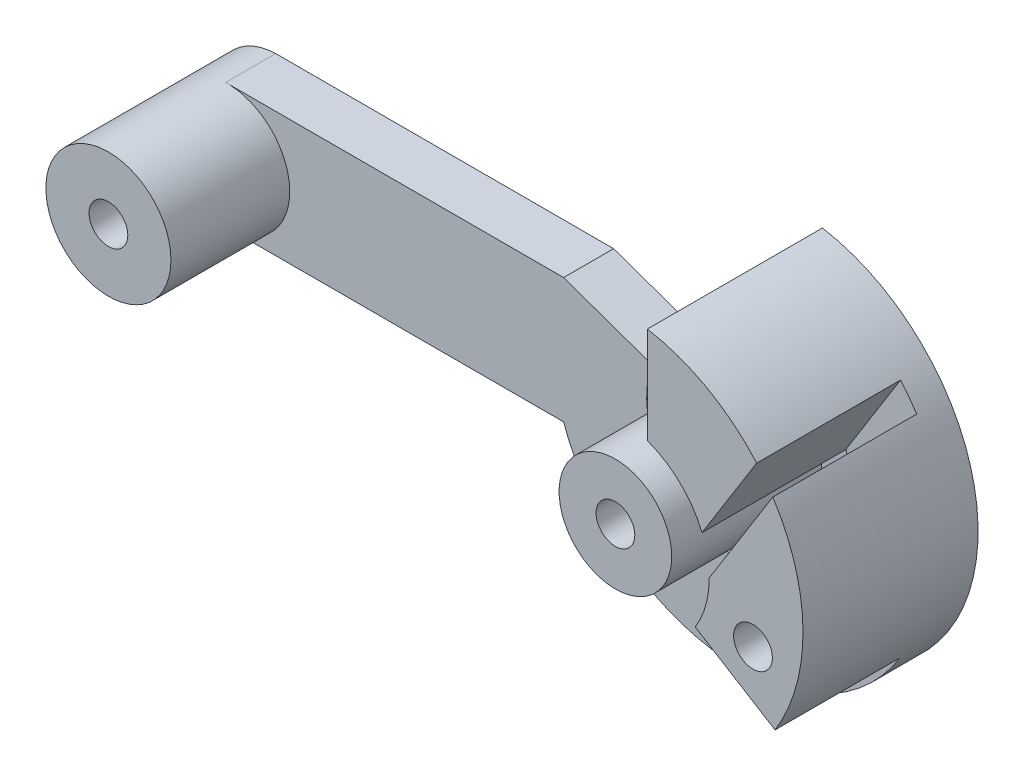
ISO-10303-21;
HEADER;
FILE_DESCRIPTION(('STEP AP214'),'2;1');
FILE_NAME('part.step','',(''),(''),'','','');
FILE_SCHEMA(('AUTOMOTIVE_DESIGN { 1 0 10303 214 1 1 1 1 }'));
ENDSEC;
DATA;
#1=APPLICATION_CONTEXT('core data for automotive mechanical design processes');
#2=APPLICATION_PROTOCOL_DEFINITION('international standard','automotive_design',2000,#1);
#3=PRODUCT_CONTEXT('',#1,'mechanical');
#4=PRODUCT('Part','Part','',(#3));
#5=PRODUCT_RELATED_PRODUCT_CATEGORY('part','',(#4));
#6=PRODUCT_DEFINITION_FORMATION('','',#4);
#7=PRODUCT_DEFINITION_CONTEXT('part definition',#1,'design');
#8=PRODUCT_DEFINITION('design','',#6,#7);
#9=PRODUCT_DEFINITION_SHAPE('','',#8);
#10=(LENGTH_UNIT() NAMED_UNIT(*) SI_UNIT(.MILLI.,.METRE.));
#11=(NAMED_UNIT(*) PLANE_ANGLE_UNIT() SI_UNIT($,.RADIAN.));
#12=(NAMED_UNIT(*) SI_UNIT($,.STERADIAN.) SOLID_ANGLE_UNIT());
#13=UNCERTAINTY_MEASURE_WITH_UNIT(LENGTH_MEASURE(1.E-05),#10,'distance_accuracy_value','');
#14=(GEOMETRIC_REPRESENTATION_CONTEXT(3) GLOBAL_UNCERTAINTY_ASSIGNED_CONTEXT((#13)) GLOBAL_UNIT_ASSIGNED_CONTEXT((#10,
#11,#12)) REPRESENTATION_CONTEXT('',''));
#15=CARTESIAN_POINT('',(0.,0.,0.));
#16=DIRECTION('',(0.,0.,1.));
#17=DIRECTION('',(1.,0.,0.));
#18=AXIS2_PLACEMENT_3D('',#15,#16,#17);
#19=CARTESIAN_POINT('',(41.0404683805728,4.39752401160121E-13,-3.));
#20=DIRECTION('',(0.,0.,1.));
#21=DIRECTION('',(1.,0.,0.));
#22=AXIS2_PLACEMENT_3D('',#19,#20,#21);
#23=PLANE('',#22);
#24=DIRECTION('',(-1.,0.,0.));
#25=VECTOR('',#24,1.);
#26=CARTESIAN_POINT('',(26.8978124930757,4.99852822817315,-3.));
#27=LINE('',#26,#25);
#28=CARTESIAN_POINT('',(26.8978124930757,4.99852822817315,-3.));
#29=VERTEX_POINT('',#28);
#30=CARTESIAN_POINT('',(0.121307675586321,4.99852822817315,-3.));
#31=VERTEX_POINT('',#30);
#32=EDGE_CURVE('E157',#29,#31,#27,.T.);
#33=ORIENTED_EDGE('',*,*,#32,.T.);
#34=CARTESIAN_POINT('',(0.,0.,-3.));
#35=DIRECTION('',(0.,0.,1.));
#36=DIRECTION('',(1.,0.,0.));
#37=AXIS2_PLACEMENT_3D('',#34,#35,#36);
#38=CIRCLE('',#37,5.);
#39=CARTESIAN_POINT('',(0.121307675586322,-4.99852822817315,-3.));
#40=VERTEX_POINT('',#39);
#41=EDGE_CURVE('E11',#31,#40,#38,.F.);
#42=ORIENTED_EDGE('',*,*,#41,.T.);
#43=DIRECTION('',(1.,0.,0.));
#44=VECTOR('',#43,1.);
#45=CARTESIAN_POINT('',(-0.121307675586332,-4.99852822817315,-3.));
#46=LINE('',#45,#44);
#47=CARTESIAN_POINT('',(26.8978124930757,-4.99852822817315,-3.));
#48=VERTEX_POINT('',#47);
#49=EDGE_CURVE('E163',#40,#48,#46,.T.);
#50=ORIENTED_EDGE('',*,*,#49,.T.);
#51=CARTESIAN_POINT('',(41.0404683805728,4.39752401160121E-13,-3.));
#52=DIRECTION('',(0.,0.,1.));
#53=DIRECTION('',(1.,0.,0.));
#54=AXIS2_PLACEMENT_3D('',#51,#52,#53);
#55=CIRCLE('',#54,15.0000000000002);
#56=CARTESIAN_POINT('',(53.8056160022448,-7.87724610488477,-3.));
#57=VERTEX_POINT('',#56);
#58=EDGE_CURVE('E299',#48,#57,#55,.T.);
#59=ORIENTED_EDGE('',*,*,#58,.T.);
#60=DIRECTION('',(-0.851009841444799,0.525149740325651,0.));
#61=VECTOR('',#60,1.);
#62=CARTESIAN_POINT('',(47.4230421914088,-3.93862305244239,-3.));
#63=LINE('',#62,#61);
#64=CARTESIAN_POINT('',(47.4230421914088,-3.93862305244239,-3.));
#65=VERTEX_POINT('',#64);
#66=EDGE_CURVE('E302',#57,#65,#63,.T.);
#67=ORIENTED_EDGE('',*,*,#66,.T.);
#68=CARTESIAN_POINT('',(41.0404683805728,0.,-3.));
#69=DIRECTION('',(0.,0.,-1.));
#70=DIRECTION('',(1.,0.,0.));
#71=AXIS2_PLACEMENT_3D('',#68,#69,#70);
#72=CIRCLE('',#71,7.5);
#73=CARTESIAN_POINT('',(33.9691404368242,2.49926411408658,-3.));
#74=VERTEX_POINT('',#73);
#75=EDGE_CURVE('E63',#65,#74,#72,.T.);
#76=ORIENTED_EDGE('',*,*,#75,.T.);
#77=DIRECTION('',(-0.942843725833139,0.333235215211544,0.));
#78=VECTOR('',#77,1.);
#79=CARTESIAN_POINT('',(33.9691404368242,2.49926411408658,-3.));
#80=LINE('',#79,#78);
#81=EDGE_CURVE('E160',#74,#29,#80,.T.);
#82=ORIENTED_EDGE('',*,*,#81,.T.);
#83=EDGE_LOOP('',(#33,#42,#50,#59,#67,#76,#82));
#84=FACE_BOUND('',#83,.T.);
#85=ADVANCED_FACE('F37',(#84),#23,.T.);
#86=CARTESIAN_POINT('',(0.,0.,-7.));
#87=DIRECTION('',(0.,0.,1.));
#88=DIRECTION('',(1.,0.,0.));
#89=AXIS2_PLACEMENT_3D('',#86,#87,#88);
#90=CYLINDRICAL_SURFACE('',#89,5.);
#91=DIRECTION('',(0.,0.,1.));
#92=VECTOR('',#91,1.);
#93=CARTESIAN_POINT('',(-0.121307675586332,-4.99852822817315,-7.));
#94=LINE('',#93,#92);
#95=CARTESIAN_POINT('',(-0.121307675586332,-4.99852822817315,-7.));
#96=VERTEX_POINT('',#95);
#97=CARTESIAN_POINT('',(-0.121307675586321,-4.99852822817315,-3.));
#98=VERTEX_POINT('',#97);
#99=EDGE_CURVE('E187',#96,#98,#94,.T.);
#100=ORIENTED_EDGE('',*,*,#99,.T.);
#101=CARTESIAN_POINT('',(0.,0.,-3.));
#102=DIRECTION('',(0.,0.,1.));
#103=DIRECTION('',(-0.0242615351172647,-0.999705645634631,0.));
#104=AXIS2_PLACEMENT_3D('',#101,#102,#103);
#105=CIRCLE('',#104,5.);
#106=EDGE_CURVE('E56',#98,#40,#105,.T.);
#107=ORIENTED_EDGE('',*,*,#106,.T.);
#108=ORIENTED_EDGE('',*,*,#41,.F.);
#109=CARTESIAN_POINT('',(0.,0.,-3.));
#110=DIRECTION('',(0.,0.,1.));
#111=DIRECTION('',(0.0242615351172642,0.999705645634631,0.));
#112=AXIS2_PLACEMENT_3D('',#109,#110,#111);
#113=CIRCLE('',#112,5.);
#114=CARTESIAN_POINT('',(-0.121307675586321,4.99852822817315,-3.));
#115=VERTEX_POINT('',#114);
#116=EDGE_CURVE('E147',#31,#115,#113,.T.);
#117=ORIENTED_EDGE('',*,*,#116,.T.);
#118=DIRECTION('',(0.,0.,1.));
#119=VECTOR('',#118,1.);
#120=CARTESIAN_POINT('',(-0.121307675586332,4.99852822817315,-7.));
#121=LINE('',#120,#119);
#122=CARTESIAN_POINT('',(-0.121307675586332,4.99852822817315,-7.));
#123=VERTEX_POINT('',#122);
#124=EDGE_CURVE('E48',#123,#115,#121,.T.);
#125=ORIENTED_EDGE('',*,*,#124,.F.);
#126=CARTESIAN_POINT('',(0.,0.,-7.));
#127=DIRECTION('',(0.,0.,1.));
#128=DIRECTION('',(1.,0.,0.));
#129=AXIS2_PLACEMENT_3D('',#126,#127,#128);
#130=CIRCLE('',#129,5.);
#131=EDGE_CURVE('E383',#123,#96,#130,.T.);
#132=ORIENTED_EDGE('',*,*,#131,.T.);
#133=EDGE_LOOP('',(#100,#107,#108,#117,#125,#132));
#134=FACE_BOUND('',#133,.T.);
#135=CARTESIAN_POINT('',(0.,0.,6.5));
#136=DIRECTION('',(0.,0.,1.));
#137=DIRECTION('',(1.,0.,0.));
#138=AXIS2_PLACEMENT_3D('',#135,#136,#137);
#139=CIRCLE('',#138,5.);
#140=CARTESIAN_POINT('',(5.,0.,6.5));
#141=VERTEX_POINT('',#140);
#142=EDGE_CURVE('E295',#141,#141,#139,.T.);
#143=ORIENTED_EDGE('',*,*,#142,.F.);
#144=EDGE_LOOP('',(#143));
#145=FACE_BOUND('',#144,.T.);
#146=ADVANCED_FACE('F39',(#134,#145),#90,.T.);
#147=CARTESIAN_POINT('',(-0.121307675586332,4.99852822817315,-7.));
#148=DIRECTION('',(0.,1.,0.));
#149=DIRECTION('',(0.,0.,1.));
#150=AXIS2_PLACEMENT_3D('',#147,#148,#149);
#151=PLANE('',#150);
#152=ORIENTED_EDGE('',*,*,#124,.T.);
#153=ORIENTED_EDGE('',*,*,#116,.F.);
#154=ORIENTED_EDGE('',*,*,#32,.F.);
#155=DIRECTION('',(0.,0.,1.));
#156=VECTOR('',#155,1.);
#157=CARTESIAN_POINT('',(26.8978124930757,4.99852822817315,-7.));
#158=LINE('',#157,#156);
#159=CARTESIAN_POINT('',(26.8978124930757,4.99852822817315,-7.));
#160=VERTEX_POINT('',#159);
#161=EDGE_CURVE('E173',#160,#29,#158,.T.);
#162=ORIENTED_EDGE('',*,*,#161,.F.);
#163=DIRECTION('',(-1.,0.,0.));
#164=VECTOR('',#163,1.);
#165=CARTESIAN_POINT('',(-0.121307675586332,4.99852822817315,-7.));
#166=LINE('',#165,#164);
#167=EDGE_CURVE('E190',#160,#123,#166,.T.);
#168=ORIENTED_EDGE('',*,*,#167,.T.);
#169=EDGE_LOOP('',(#152,#153,#154,#162,#168));
#170=FACE_BOUND('',#169,.T.);
#171=ADVANCED_FACE('F155',(#170),#151,.T.);
#172=CARTESIAN_POINT('',(-0.121307675586332,-4.99852822817315,-7.));
#173=DIRECTION('',(0.,-1.,0.));
#174=DIRECTION('',(0.,0.,-1.));
#175=AXIS2_PLACEMENT_3D('',#172,#173,#174);
#176=PLANE('',#175);
#177=DIRECTION('',(0.,0.,1.));
#178=VECTOR('',#177,1.);
#179=CARTESIAN_POINT('',(26.8978124930757,-4.99852822817315,-7.));
#180=LINE('',#179,#178);
#181=CARTESIAN_POINT('',(26.8978124930757,-4.99852822817315,-7.));
#182=VERTEX_POINT('',#181);
#183=EDGE_CURVE('E183',#182,#48,#180,.T.);
#184=ORIENTED_EDGE('',*,*,#183,.T.);
#185=ORIENTED_EDGE('',*,*,#49,.F.);
#186=ORIENTED_EDGE('',*,*,#106,.F.);
#187=ORIENTED_EDGE('',*,*,#99,.F.);
#188=DIRECTION('',(1.,0.,0.));
#189=VECTOR('',#188,1.);
#190=CARTESIAN_POINT('',(-0.121307675586332,-4.99852822817315,-7.));
#191=LINE('',#190,#189);
#192=EDGE_CURVE('E386',#96,#182,#191,.T.);
#193=ORIENTED_EDGE('',*,*,#192,.T.);
#194=EDGE_LOOP('',(#184,#185,#186,#187,#193));
#195=FACE_BOUND('',#194,.T.);
#196=ADVANCED_FACE('F199',(#195),#176,.T.);
#197=CARTESIAN_POINT('',(0.,0.,-7.));
#198=DIRECTION('',(0.,0.,1.));
#199=DIRECTION('',(1.,0.,0.));
#200=AXIS2_PLACEMENT_3D('',#197,#198,#199);
#201=CYLINDRICAL_SURFACE('',#200,1.55);
#202=CARTESIAN_POINT('',(0.,0.,-7.));
#203=DIRECTION('',(0.,0.,1.));
#204=DIRECTION('',(1.,0.,0.));
#205=AXIS2_PLACEMENT_3D('',#202,#203,#204);
#206=CIRCLE('',#205,1.55);
#207=CARTESIAN_POINT('',(1.55,0.,-7.));
#208=VERTEX_POINT('',#207);
#209=EDGE_CURVE('E380',#208,#208,#206,.T.);
#210=ORIENTED_EDGE('',*,*,#209,.F.);
#211=EDGE_LOOP('',(#210));
#212=FACE_BOUND('',#211,.T.);
#213=CARTESIAN_POINT('',(0.,0.,6.5));
#214=DIRECTION('',(0.,0.,1.));
#215=DIRECTION('',(1.,0.,0.));
#216=AXIS2_PLACEMENT_3D('',#213,#214,#215);
#217=CIRCLE('',#216,1.55);
#218=CARTESIAN_POINT('',(1.55,0.,6.5));
#219=VERTEX_POINT('',#218);
#220=EDGE_CURVE('E290',#219,#219,#217,.T.);
#221=ORIENTED_EDGE('',*,*,#220,.T.);
#222=EDGE_LOOP('',(#221));
#223=FACE_BOUND('',#222,.T.);
#224=ADVANCED_FACE('F208',(#212,#223),#201,.F.);
#225=CARTESIAN_POINT('',(26.8978124930757,4.99852822817315,-27.8577658413252));
#226=DIRECTION('',(-0.333235215211544,-0.942843725833139,0.));
#227=DIRECTION('',(0.942843725833139,-0.333235215211544,0.));
#228=AXIS2_PLACEMENT_3D('',#225,#226,#227);
#229=PLANE('',#228);
#230=ORIENTED_EDGE('',*,*,#81,.F.);
#231=DIRECTION('',(0.,0.,1.));
#232=VECTOR('',#231,1.);
#233=CARTESIAN_POINT('',(33.9691404368242,2.49926411408658,-27.8577658413252));
#234=LINE('',#233,#232);
#235=CARTESIAN_POINT('',(33.9691404368242,2.49926411408658,-5.));
#236=VERTEX_POINT('',#235);
#237=EDGE_CURVE('E354',#236,#74,#234,.T.);
#238=ORIENTED_EDGE('',*,*,#237,.F.);
#239=CARTESIAN_POINT('',(33.9691404368242,2.49926411408658,-7.));
#240=VERTEX_POINT('',#239);
#241=EDGE_CURVE('E361',#240,#236,#234,.T.);
#242=ORIENTED_EDGE('',*,*,#241,.F.);
#243=DIRECTION('',(-0.942843725833139,0.333235215211544,0.));
#244=VECTOR('',#243,1.);
#245=CARTESIAN_POINT('',(26.8978124930757,4.99852822817315,-7.));
#246=LINE('',#245,#244);
#247=EDGE_CURVE('E351',#240,#160,#246,.T.);
#248=ORIENTED_EDGE('',*,*,#247,.T.);
#249=ORIENTED_EDGE('',*,*,#161,.T.);
#250=EDGE_LOOP('',(#230,#238,#242,#248,#249));
#251=FACE_BOUND('',#250,.T.);
#252=ADVANCED_FACE('F223',(#251),#229,.F.);
#253=CARTESIAN_POINT('',(0.,0.,7.));
#254=DIRECTION('',(0.,0.,1.));
#255=DIRECTION('',(1.,0.,0.));
#256=AXIS2_PLACEMENT_3D('',#253,#254,#255);
#257=PLANE('',#256);
#258=DIRECTION('',(-0.529919264233204,-0.848048096156427,0.));
#259=VECTOR('',#258,1.);
#260=CARTESIAN_POINT('',(33.2057338367623,-20.7492453822513,7.));
#261=LINE('',#260,#259);
#262=CARTESIAN_POINT('',(52.3375006508902,9.86798165195936,7.));
#263=VERTEX_POINT('',#262);
#264=CARTESIAN_POINT('',(47.9676463927873,2.87475299584016,7.));
#265=VERTEX_POINT('',#264);
#266=EDGE_CURVE('E310',#263,#265,#261,.T.);
#267=ORIENTED_EDGE('',*,*,#266,.F.);
#268=CARTESIAN_POINT('',(41.0404683805728,0.,7.));
#269=DIRECTION('',(0.,0.,1.));
#270=DIRECTION('',(1.,0.,0.));
#271=AXIS2_PLACEMENT_3D('',#268,#269,#270);
#272=CIRCLE('',#271,15.);
#273=CARTESIAN_POINT('',(43.5944588090934,14.7809719873567,7.));
#274=VERTEX_POINT('',#273);
#275=EDGE_CURVE('E374',#263,#274,#272,.T.);
#276=ORIENTED_EDGE('',*,*,#275,.T.);
#277=DIRECTION('',(0.,1.,0.));
#278=VECTOR('',#277,1.);
#279=CARTESIAN_POINT('',(43.5944588090934,14.7809719873567,7.));
#280=LINE('',#279,#278);
#281=CARTESIAN_POINT('',(43.5944588090934,7.05174679714359,7.));
#282=VERTEX_POINT('',#281);
#283=EDGE_CURVE('E345',#282,#274,#280,.T.);
#284=ORIENTED_EDGE('',*,*,#283,.F.);
#285=CARTESIAN_POINT('',(41.0404683805728,0.,7.));
#286=DIRECTION('',(0.,0.,1.));
#287=DIRECTION('',(1.,0.,0.));
#288=AXIS2_PLACEMENT_3D('',#285,#286,#287);
#289=CIRCLE('',#288,7.5);
#290=EDGE_CURVE('E368',#265,#282,#289,.T.);
#291=ORIENTED_EDGE('',*,*,#290,.F.);
#292=EDGE_LOOP('',(#267,#276,#284,#291));
#293=FACE_BOUND('',#292,.T.);
#294=ADVANCED_FACE('F212',(#293),#257,.T.);
#295=CARTESIAN_POINT('',(41.0404683805728,0.,-7.));
#296=DIRECTION('',(0.,0.,1.));
#297=DIRECTION('',(1.,0.,0.));
#298=AXIS2_PLACEMENT_3D('',#295,#296,#297);
#299=CYLINDRICAL_SURFACE('',#298,15.);
#300=DIRECTION('',(0.,0.,1.));
#301=VECTOR('',#300,1.);
#302=CARTESIAN_POINT('',(53.8056160022448,-7.87724610488477,-3.));
#303=LINE('',#302,#301);
#304=CARTESIAN_POINT('',(53.8056160022448,-7.87724610488477,7.));
#305=VERTEX_POINT('',#304);
#306=EDGE_CURVE('E311',#57,#305,#303,.T.);
#307=ORIENTED_EDGE('',*,*,#306,.F.);
#308=ORIENTED_EDGE('',*,*,#58,.F.);
#309=ORIENTED_EDGE('',*,*,#183,.F.);
#310=CARTESIAN_POINT('',(41.0404683805728,0.,-7.));
#311=DIRECTION('',(0.,0.,1.));
#312=DIRECTION('',(1.,0.,0.));
#313=AXIS2_PLACEMENT_3D('',#310,#311,#312);
#314=CIRCLE('',#313,15.);
#315=CARTESIAN_POINT('',(43.5944588090934,14.7809719873567,-7.));
#316=VERTEX_POINT('',#315);
#317=EDGE_CURVE('E388',#182,#316,#314,.T.);
#318=ORIENTED_EDGE('',*,*,#317,.T.);
#319=DIRECTION('',(0.,0.,1.));
#320=VECTOR('',#319,1.);
#321=CARTESIAN_POINT('',(43.5944588090934,14.7809719873567,-27.8577658413252));
#322=LINE('',#321,#320);
#323=EDGE_CURVE('E349',#316,#274,#322,.T.);
#324=ORIENTED_EDGE('',*,*,#323,.T.);
#325=ORIENTED_EDGE('',*,*,#275,.F.);
#326=DIRECTION('',(0.,0.,1.));
#327=VECTOR('',#326,1.);
#328=CARTESIAN_POINT('',(52.3375006508902,9.86798165195936,-4.5));
#329=LINE('',#328,#327);
#330=CARTESIAN_POINT('',(52.3375006508902,9.86798165195936,-4.5));
#331=VERTEX_POINT('',#330);
#332=EDGE_CURVE('E329',#331,#263,#329,.T.);
#333=ORIENTED_EDGE('',*,*,#332,.F.);
#334=CARTESIAN_POINT('',(41.0404683805728,0.,-4.5));
#335=DIRECTION('',(0.,0.,1.));
#336=DIRECTION('',(1.,0.,0.));
#337=AXIS2_PLACEMENT_3D('',#334,#335,#336);
#338=CIRCLE('',#337,15.);
#339=CARTESIAN_POINT('',(53.6276862873397,8.15855044524252,-4.5));
#340=VERTEX_POINT('',#339);
#341=EDGE_CURVE('E322',#331,#340,#338,.F.);
#342=ORIENTED_EDGE('',*,*,#341,.T.);
#343=DIRECTION('',(0.,0.,1.));
#344=VECTOR('',#343,1.);
#345=CARTESIAN_POINT('',(53.6276862873397,8.15855044524252,-4.5));
#346=LINE('',#345,#344);
#347=CARTESIAN_POINT('',(53.6276862873397,8.15855044524252,7.));
#348=VERTEX_POINT('',#347);
#349=EDGE_CURVE('E332',#340,#348,#346,.T.);
#350=ORIENTED_EDGE('',*,*,#349,.T.);
#351=EDGE_CURVE('E378',#305,#348,#272,.T.);
#352=ORIENTED_EDGE('',*,*,#351,.F.);
#353=EDGE_LOOP('',(#307,#308,#309,#318,#324,#325,#333,#342,#350,#352));
#354=FACE_BOUND('',#353,.T.);
#355=ADVANCED_FACE('F209',(#354),#299,.T.);
#356=CARTESIAN_POINT('',(0.,0.,-7.));
#357=DIRECTION('',(0.,0.,1.));
#358=DIRECTION('',(1.,0.,0.));
#359=AXIS2_PLACEMENT_3D('',#356,#357,#358);
#360=PLANE('',#359);
#361=CARTESIAN_POINT('',(52.0404683805728,-3.,-7.));
#362=DIRECTION('',(0.,0.,1.));
#363=DIRECTION('',(1.,0.,0.));
#364=AXIS2_PLACEMENT_3D('',#361,#362,#363);
#365=CIRCLE('',#364,1.55);
#366=CARTESIAN_POINT('',(53.5904683805728,-3.,-7.));
#367=VERTEX_POINT('',#366);
#368=EDGE_CURVE('E285',#367,#367,#365,.F.);
#369=ORIENTED_EDGE('',*,*,#368,.F.);
#370=EDGE_LOOP('',(#369));
#371=FACE_BOUND('',#370,.T.);
#372=CARTESIAN_POINT('',(41.0404683805728,0.,-7.));
#373=DIRECTION('',(0.,0.,1.));
#374=DIRECTION('',(1.,0.,0.));
#375=AXIS2_PLACEMENT_3D('',#372,#373,#374);
#376=CIRCLE('',#375,1.54999999999999);
#377=CARTESIAN_POINT('',(42.5904683805728,0.,-7.));
#378=VERTEX_POINT('',#377);
#379=EDGE_CURVE('E342',#378,#378,#376,.F.);
#380=ORIENTED_EDGE('',*,*,#379,.F.);
#381=EDGE_LOOP('',(#380));
#382=FACE_BOUND('',#381,.T.);
#383=ORIENTED_EDGE('',*,*,#209,.T.);
#384=EDGE_LOOP('',(#383));
#385=FACE_BOUND('',#384,.T.);
#386=CARTESIAN_POINT('',(41.0404683805728,0.,-7.));
#387=DIRECTION('',(0.,0.,1.));
#388=DIRECTION('',(1.,0.,0.));
#389=AXIS2_PLACEMENT_3D('',#386,#387,#388);
#390=CIRCLE('',#389,7.50000000000002);
#391=CARTESIAN_POINT('',(43.5944588090934,7.05174679714359,-7.));
#392=VERTEX_POINT('',#391);
#393=EDGE_CURVE('E346',#392,#240,#390,.T.);
#394=ORIENTED_EDGE('',*,*,#393,.F.);
#395=DIRECTION('',(0.,-1.,0.));
#396=VECTOR('',#395,1.);
#397=CARTESIAN_POINT('',(43.5944588090934,14.7809719873567,-7.));
#398=LINE('',#397,#396);
#399=EDGE_CURVE('E348',#316,#392,#398,.T.);
#400=ORIENTED_EDGE('',*,*,#399,.F.);
#401=ORIENTED_EDGE('',*,*,#317,.F.);
#402=ORIENTED_EDGE('',*,*,#192,.F.);
#403=ORIENTED_EDGE('',*,*,#131,.F.);
#404=ORIENTED_EDGE('',*,*,#167,.F.);
#405=ORIENTED_EDGE('',*,*,#247,.F.);
#406=EDGE_LOOP('',(#394,#400,#401,#402,#403,#404,#405));
#407=FACE_BOUND('',#406,.T.);
#408=ADVANCED_FACE('F211',(#371,#382,#385,#407),#360,.F.);
#409=CARTESIAN_POINT('',(52.0404683805728,-3.,7.));
#410=DIRECTION('',(0.,0.,1.));
#411=DIRECTION('',(1.,0.,0.));
#412=AXIS2_PLACEMENT_3D('',#409,#410,#411);
#413=CIRCLE('',#412,1.55);
#414=CARTESIAN_POINT('',(53.5904683805728,-3.,7.));
#415=VERTEX_POINT('',#414);
#416=EDGE_CURVE('E288',#415,#415,#413,.T.);
#417=ORIENTED_EDGE('',*,*,#416,.F.);
#418=EDGE_LOOP('',(#417));
#419=FACE_BOUND('',#418,.T.);
#420=DIRECTION('',(-0.851009841444799,0.525149740325651,0.));
#421=VECTOR('',#420,1.);
#422=CARTESIAN_POINT('',(47.4230421914088,-3.93862305244239,7.));
#423=LINE('',#422,#421);
#424=CARTESIAN_POINT('',(47.4230421914088,-3.93862305244239,7.));
#425=VERTEX_POINT('',#424);
#426=EDGE_CURVE('E298',#305,#425,#423,.T.);
#427=ORIENTED_EDGE('',*,*,#426,.F.);
#428=ORIENTED_EDGE('',*,*,#351,.T.);
#429=DIRECTION('',(0.529919264233204,0.848048096156427,0.));
#430=VECTOR('',#429,1.);
#431=CARTESIAN_POINT('',(34.9018300290752,-21.8090839107177,7.));
#432=LINE('',#431,#430);
#433=CARTESIAN_POINT('',(48.5404485012593,0.0172681587357858,7.));
#434=VERTEX_POINT('',#433);
#435=EDGE_CURVE('E316',#434,#348,#432,.T.);
#436=ORIENTED_EDGE('',*,*,#435,.F.);
#437=EDGE_CURVE('E376',#425,#434,#289,.T.);
#438=ORIENTED_EDGE('',*,*,#437,.F.);
#439=EDGE_LOOP('',(#427,#428,#436,#438));
#440=FACE_BOUND('',#439,.T.);
#441=ADVANCED_FACE('F219',(#419,#440),#257,.T.);
#442=CARTESIAN_POINT('',(41.0404683805728,0.,-5.));
#443=DIRECTION('',(0.,0.,1.));
#444=DIRECTION('',(1.,0.,0.));
#445=AXIS2_PLACEMENT_3D('',#442,#443,#444);
#446=CYLINDRICAL_SURFACE('',#445,7.5);
#447=ORIENTED_EDGE('',*,*,#75,.F.);
#448=DIRECTION('',(0.,0.,1.));
#449=VECTOR('',#448,1.);
#450=CARTESIAN_POINT('',(47.4230421914088,-3.93862305244239,-3.));
#451=LINE('',#450,#449);
#452=EDGE_CURVE('E307',#65,#425,#451,.T.);
#453=ORIENTED_EDGE('',*,*,#452,.T.);
#454=ORIENTED_EDGE('',*,*,#437,.T.);
#455=DIRECTION('',(0.,0.,1.));
#456=VECTOR('',#455,1.);
#457=CARTESIAN_POINT('',(48.5404485012593,0.0172681587357858,-4.5));
#458=LINE('',#457,#456);
#459=CARTESIAN_POINT('',(48.5404485012593,0.0172681587357858,-4.5));
#460=VERTEX_POINT('',#459);
#461=EDGE_CURVE('E335',#460,#434,#458,.T.);
#462=ORIENTED_EDGE('',*,*,#461,.F.);
#463=CARTESIAN_POINT('',(41.0404683805728,0.,-4.5));
#464=DIRECTION('',(0.,0.,1.));
#465=DIRECTION('',(1.,0.,0.));
#466=AXIS2_PLACEMENT_3D('',#463,#464,#465);
#467=CIRCLE('',#466,7.49999999999998);
#468=CARTESIAN_POINT('',(47.9676463927873,2.87475299584016,-4.5));
#469=VERTEX_POINT('',#468);
#470=EDGE_CURVE('E315',#469,#460,#467,.F.);
#471=ORIENTED_EDGE('',*,*,#470,.F.);
#472=DIRECTION('',(0.,0.,1.));
#473=VECTOR('',#472,1.);
#474=CARTESIAN_POINT('',(47.9676463927873,2.87475299584016,-4.5));
#475=LINE('',#474,#473);
#476=EDGE_CURVE('E325',#469,#265,#475,.T.);
#477=ORIENTED_EDGE('',*,*,#476,.T.);
#478=ORIENTED_EDGE('',*,*,#290,.T.);
#479=DIRECTION('',(0.,0.,1.));
#480=VECTOR('',#479,1.);
#481=CARTESIAN_POINT('',(43.5944588090934,7.05174679714359,-27.8577658413252));
#482=LINE('',#481,#480);
#483=CARTESIAN_POINT('',(43.5944588090934,7.05174679714359,-5.));
#484=VERTEX_POINT('',#483);
#485=EDGE_CURVE('E360',#484,#282,#482,.T.);
#486=ORIENTED_EDGE('',*,*,#485,.F.);
#487=CARTESIAN_POINT('',(41.0404683805728,0.,-5.));
#488=DIRECTION('',(0.,0.,1.));
#489=DIRECTION('',(1.,0.,0.));
#490=AXIS2_PLACEMENT_3D('',#487,#488,#489);
#491=CIRCLE('',#490,7.5);
#492=EDGE_CURVE('E375',#236,#484,#491,.T.);
#493=ORIENTED_EDGE('',*,*,#492,.F.);
#494=ORIENTED_EDGE('',*,*,#237,.T.);
#495=EDGE_LOOP('',(#447,#453,#454,#462,#471,#477,#478,#486,#493,#494));
#496=FACE_BOUND('',#495,.T.);
#497=ADVANCED_FACE('F227',(#496),#446,.F.);
#498=CARTESIAN_POINT('',(41.0404683805728,0.,-5.));
#499=DIRECTION('',(0.,0.,1.));
#500=DIRECTION('',(1.,0.,0.));
#501=AXIS2_PLACEMENT_3D('',#498,#499,#500);
#502=PLANE('',#501);
#503=CARTESIAN_POINT('',(41.0404683805728,0.,-5.));
#504=DIRECTION('',(0.,0.,1.));
#505=DIRECTION('',(1.,0.,0.));
#506=AXIS2_PLACEMENT_3D('',#503,#504,#505);
#507=CIRCLE('',#506,4.5);
#508=CARTESIAN_POINT('',(45.5404683805728,0.,-5.));
#509=VERTEX_POINT('',#508);
#510=EDGE_CURVE('E365',#509,#509,#507,.T.);
#511=ORIENTED_EDGE('',*,*,#510,.F.);
#512=EDGE_LOOP('',(#511));
#513=FACE_BOUND('',#512,.T.);
#514=EDGE_CURVE('E371',#484,#236,#491,.T.);
#515=ORIENTED_EDGE('',*,*,#514,.T.);
#516=ORIENTED_EDGE('',*,*,#492,.T.);
#517=EDGE_LOOP('',(#515,#516));
#518=FACE_BOUND('',#517,.T.);
#519=ADVANCED_FACE('F232',(#513,#518),#502,.T.);
#520=CARTESIAN_POINT('',(41.0404683805728,0.,-5.));
#521=DIRECTION('',(0.,0.,1.));
#522=DIRECTION('',(1.,0.,0.));
#523=AXIS2_PLACEMENT_3D('',#520,#521,#522);
#524=CYLINDRICAL_SURFACE('',#523,4.5);
#525=ORIENTED_EDGE('',*,*,#510,.T.);
#526=EDGE_LOOP('',(#525));
#527=FACE_BOUND('',#526,.T.);
#528=CARTESIAN_POINT('',(41.0404683805728,0.,7.));
#529=DIRECTION('',(0.,0.,1.));
#530=DIRECTION('',(1.,0.,0.));
#531=AXIS2_PLACEMENT_3D('',#528,#529,#530);
#532=CIRCLE('',#531,4.5);
#533=CARTESIAN_POINT('',(45.5404683805728,0.,7.));
#534=VERTEX_POINT('',#533);
#535=EDGE_CURVE('E364',#534,#534,#532,.T.);
#536=ORIENTED_EDGE('',*,*,#535,.F.);
#537=EDGE_LOOP('',(#536));
#538=FACE_BOUND('',#537,.T.);
#539=ADVANCED_FACE('F236',(#527,#538),#524,.T.);
#540=CARTESIAN_POINT('',(41.0404683805728,0.,7.));
#541=DIRECTION('',(0.,0.,1.));
#542=DIRECTION('',(1.,0.,0.));
#543=AXIS2_PLACEMENT_3D('',#540,#541,#542);
#544=CIRCLE('',#543,1.54999999999999);
#545=CARTESIAN_POINT('',(42.5904683805728,0.,7.));
#546=VERTEX_POINT('',#545);
#547=EDGE_CURVE('E331',#546,#546,#544,.T.);
#548=ORIENTED_EDGE('',*,*,#547,.F.);
#549=EDGE_LOOP('',(#548));
#550=FACE_BOUND('',#549,.T.);
#551=ORIENTED_EDGE('',*,*,#535,.T.);
#552=EDGE_LOOP('',(#551));
#553=FACE_BOUND('',#552,.T.);
#554=ADVANCED_FACE('F229',(#550,#553),#257,.T.);
#555=CARTESIAN_POINT('',(43.5944588090934,14.7809719873567,-27.8577658413252));
#556=DIRECTION('',(1.,0.,0.));
#557=DIRECTION('',(0.,0.,-1.));
#558=AXIS2_PLACEMENT_3D('',#555,#556,#557);
#559=PLANE('',#558);
#560=ORIENTED_EDGE('',*,*,#399,.T.);
#561=EDGE_CURVE('E357',#392,#484,#482,.T.);
#562=ORIENTED_EDGE('',*,*,#561,.T.);
#563=ORIENTED_EDGE('',*,*,#485,.T.);
#564=ORIENTED_EDGE('',*,*,#283,.T.);
#565=ORIENTED_EDGE('',*,*,#323,.F.);
#566=EDGE_LOOP('',(#560,#562,#563,#564,#565));
#567=FACE_BOUND('',#566,.T.);
#568=ADVANCED_FACE('F247',(#567),#559,.F.);
#569=CARTESIAN_POINT('',(41.0404683805728,0.,-27.8577658413252));
#570=DIRECTION('',(0.,0.,1.));
#571=DIRECTION('',(1.,0.,0.));
#572=AXIS2_PLACEMENT_3D('',#569,#570,#571);
#573=CYLINDRICAL_SURFACE('',#572,7.50000000000002);
#574=ORIENTED_EDGE('',*,*,#514,.F.);
#575=ORIENTED_EDGE('',*,*,#561,.F.);
#576=ORIENTED_EDGE('',*,*,#393,.T.);
#577=ORIENTED_EDGE('',*,*,#241,.T.);
#578=EDGE_LOOP('',(#574,#575,#576,#577));
#579=FACE_BOUND('',#578,.T.);
#580=ADVANCED_FACE('F243',(#579),#573,.T.);
#581=CARTESIAN_POINT('',(41.0404683805728,0.,-11.3840620433566));
#582=DIRECTION('',(0.,0.,1.));
#583=DIRECTION('',(1.,0.,0.));
#584=AXIS2_PLACEMENT_3D('',#581,#582,#583);
#585=CYLINDRICAL_SURFACE('',#584,1.54999999999999);
#586=ORIENTED_EDGE('',*,*,#379,.T.);
#587=EDGE_LOOP('',(#586));
#588=FACE_BOUND('',#587,.T.);
#589=ORIENTED_EDGE('',*,*,#547,.T.);
#590=EDGE_LOOP('',(#589));
#591=FACE_BOUND('',#590,.T.);
#592=ADVANCED_FACE('F246',(#588,#591),#585,.F.);
#593=CARTESIAN_POINT('',(33.2057338367623,-20.7492453822513,-4.5));
#594=DIRECTION('',(-0.848048096156427,0.529919264233204,0.));
#595=DIRECTION('',(-0.529919264233204,-0.848048096156427,0.));
#596=AXIS2_PLACEMENT_3D('',#593,#594,#595);
#597=PLANE('',#596);
#598=ORIENTED_EDGE('',*,*,#266,.T.);
#599=ORIENTED_EDGE('',*,*,#476,.F.);
#600=DIRECTION('',(-0.529919264233204,-0.848048096156427,0.));
#601=VECTOR('',#600,1.);
#602=CARTESIAN_POINT('',(33.2057338367623,-20.7492453822513,-4.5));
#603=LINE('',#602,#601);
#604=EDGE_CURVE('E313',#331,#469,#603,.T.);
#605=ORIENTED_EDGE('',*,*,#604,.F.);
#606=ORIENTED_EDGE('',*,*,#332,.T.);
#607=EDGE_LOOP('',(#598,#599,#605,#606));
#608=FACE_BOUND('',#607,.T.);
#609=ADVANCED_FACE('F254',(#608),#597,.F.);
#610=CARTESIAN_POINT('',(34.9018300290752,-21.8090839107177,-4.5));
#611=DIRECTION('',(0.848048096156427,-0.529919264233204,0.));
#612=DIRECTION('',(0.529919264233204,0.848048096156427,0.));
#613=AXIS2_PLACEMENT_3D('',#610,#611,#612);
#614=PLANE('',#613);
#615=ORIENTED_EDGE('',*,*,#435,.T.);
#616=ORIENTED_EDGE('',*,*,#349,.F.);
#617=DIRECTION('',(0.529919264233204,0.848048096156427,0.));
#618=VECTOR('',#617,1.);
#619=CARTESIAN_POINT('',(34.9018300290752,-21.8090839107177,-4.5));
#620=LINE('',#619,#618);
#621=EDGE_CURVE('E319',#460,#340,#620,.T.);
#622=ORIENTED_EDGE('',*,*,#621,.F.);
#623=ORIENTED_EDGE('',*,*,#461,.T.);
#624=EDGE_LOOP('',(#615,#616,#622,#623));
#625=FACE_BOUND('',#624,.T.);
#626=ADVANCED_FACE('F258',(#625),#614,.F.);
#627=CARTESIAN_POINT('',(0.,0.,-4.5));
#628=DIRECTION('',(0.,0.,1.));
#629=DIRECTION('',(1.,0.,0.));
#630=AXIS2_PLACEMENT_3D('',#627,#628,#629);
#631=PLANE('',#630);
#632=ORIENTED_EDGE('',*,*,#604,.T.);
#633=ORIENTED_EDGE('',*,*,#470,.T.);
#634=ORIENTED_EDGE('',*,*,#621,.T.);
#635=ORIENTED_EDGE('',*,*,#341,.F.);
#636=EDGE_LOOP('',(#632,#633,#634,#635));
#637=FACE_BOUND('',#636,.T.);
#638=ADVANCED_FACE('F262',(#637),#631,.T.);
#639=CARTESIAN_POINT('',(47.4230421914088,-3.93862305244239,-3.));
#640=DIRECTION('',(0.525149740325651,0.851009841444799,0.));
#641=DIRECTION('',(-0.851009841444799,0.525149740325651,0.));
#642=AXIS2_PLACEMENT_3D('',#639,#640,#641);
#643=PLANE('',#642);
#644=ORIENTED_EDGE('',*,*,#426,.T.);
#645=ORIENTED_EDGE('',*,*,#452,.F.);
#646=ORIENTED_EDGE('',*,*,#66,.F.);
#647=ORIENTED_EDGE('',*,*,#306,.T.);
#648=EDGE_LOOP('',(#644,#645,#646,#647));
#649=FACE_BOUND('',#648,.T.);
#650=ADVANCED_FACE('F266',(#649),#643,.F.);
#651=CARTESIAN_POINT('',(0.,0.,6.5));
#652=DIRECTION('',(0.,0.,1.));
#653=DIRECTION('',(1.,0.,0.));
#654=AXIS2_PLACEMENT_3D('',#651,#652,#653);
#655=PLANE('',#654);
#656=ORIENTED_EDGE('',*,*,#142,.T.);
#657=EDGE_LOOP('',(#656));
#658=FACE_BOUND('',#657,.T.);
#659=ORIENTED_EDGE('',*,*,#220,.F.);
#660=EDGE_LOOP('',(#659));
#661=FACE_BOUND('',#660,.T.);
#662=ADVANCED_FACE('F270',(#658,#661),#655,.T.);
#663=CARTESIAN_POINT('',(52.0404683805728,-3.,-11.3840620433566));
#664=DIRECTION('',(0.,0.,1.));
#665=DIRECTION('',(1.,0.,0.));
#666=AXIS2_PLACEMENT_3D('',#663,#664,#665);
#667=CYLINDRICAL_SURFACE('',#666,1.55);
#668=ORIENTED_EDGE('',*,*,#368,.T.);
#669=EDGE_LOOP('',(#668));
#670=FACE_BOUND('',#669,.T.);
#671=ORIENTED_EDGE('',*,*,#416,.T.);
#672=EDGE_LOOP('',(#671));
#673=FACE_BOUND('',#672,.T.);
#674=ADVANCED_FACE('F276',(#670,#673),#667,.F.);
#675=CLOSED_SHELL('',(#85,#146,#171,#196,#224,#252,#294,#355,#408,#441,#497,#519,#539,#554,#568,
#580,#592,#609,#626,#638,#650,#662,#674));
#676=MANIFOLD_SOLID_BREP('B2',#675);
#677=ADVANCED_BREP_SHAPE_REPRESENTATION('',(#18,#676),#14);
#678=SHAPE_DEFINITION_REPRESENTATION(#9,#677);
ENDSEC;
END-ISO-10303-21;
